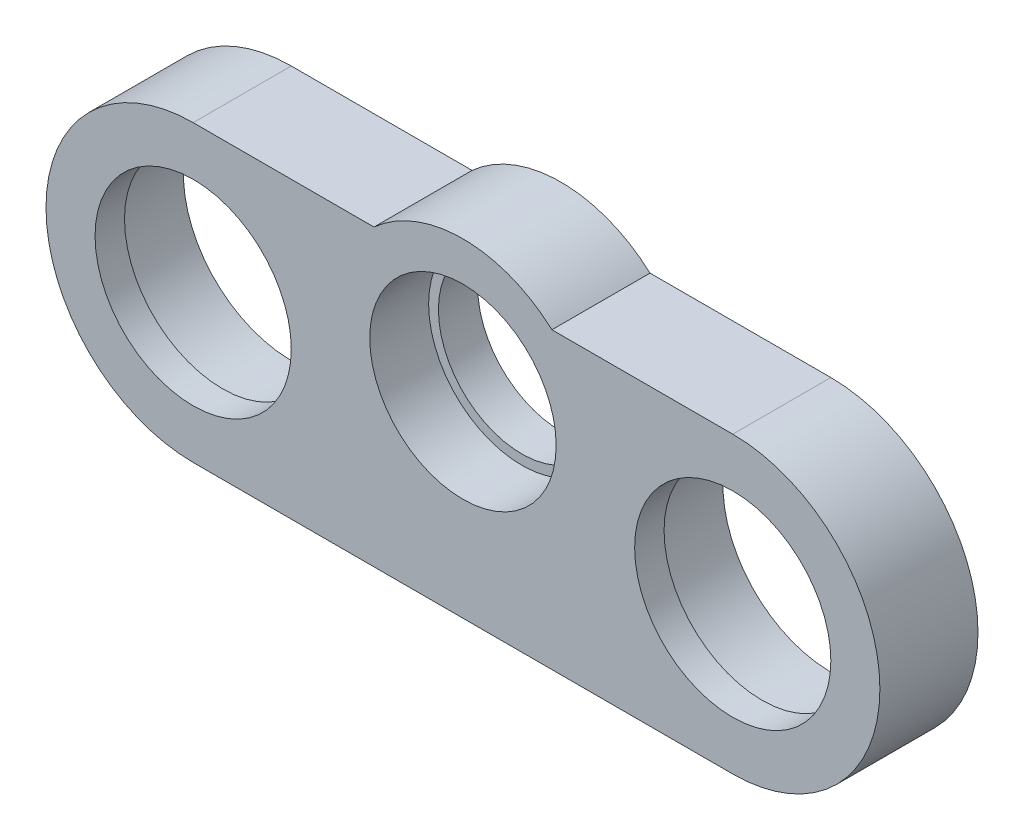
ISO-10303-21;
HEADER;
FILE_DESCRIPTION(('STEP AP214'),'2;1');
FILE_NAME('part.step','',(''),(''),'','','');
FILE_SCHEMA(('AUTOMOTIVE_DESIGN { 1 0 10303 214 1 1 1 1 }'));
ENDSEC;
DATA;
#1=APPLICATION_CONTEXT('core data for automotive mechanical design processes');
#2=APPLICATION_PROTOCOL_DEFINITION('international standard','automotive_design',2000,#1);
#3=PRODUCT_CONTEXT('',#1,'mechanical');
#4=PRODUCT('Part','Part','',(#3));
#5=PRODUCT_RELATED_PRODUCT_CATEGORY('part','',(#4));
#6=PRODUCT_DEFINITION_FORMATION('','',#4);
#7=PRODUCT_DEFINITION_CONTEXT('part definition',#1,'design');
#8=PRODUCT_DEFINITION('design','',#6,#7);
#9=PRODUCT_DEFINITION_SHAPE('','',#8);
#10=(LENGTH_UNIT() NAMED_UNIT(*) SI_UNIT(.MILLI.,.METRE.));
#11=(NAMED_UNIT(*) PLANE_ANGLE_UNIT() SI_UNIT($,.RADIAN.));
#12=(NAMED_UNIT(*) SI_UNIT($,.STERADIAN.) SOLID_ANGLE_UNIT());
#13=UNCERTAINTY_MEASURE_WITH_UNIT(LENGTH_MEASURE(1.E-05),#10,'distance_accuracy_value','');
#14=(GEOMETRIC_REPRESENTATION_CONTEXT(3) GLOBAL_UNCERTAINTY_ASSIGNED_CONTEXT((#13)) GLOBAL_UNIT_ASSIGNED_CONTEXT((#10,
#11,#12)) REPRESENTATION_CONTEXT('',''));
#15=CARTESIAN_POINT('',(0.,0.,0.));
#16=DIRECTION('',(0.,0.,1.));
#17=DIRECTION('',(1.,0.,0.));
#18=AXIS2_PLACEMENT_3D('',#15,#16,#17);
#19=CARTESIAN_POINT('',(0.,5.,10.));
#20=DIRECTION('',(0.,0.,-1.));
#21=DIRECTION('',(-1.,0.,0.));
#22=AXIS2_PLACEMENT_3D('',#19,#20,#21);
#23=CYLINDRICAL_SURFACE('',#22,9.5);
#24=CARTESIAN_POINT('',(0.,5.,10.));
#25=DIRECTION('',(0.,0.,1.));
#26=DIRECTION('',(1.,0.,0.));
#27=AXIS2_PLACEMENT_3D('',#24,#25,#26);
#28=CIRCLE('',#27,9.5);
#29=CARTESIAN_POINT('',(9.5,5.,10.));
#30=VERTEX_POINT('',#29);
#31=EDGE_CURVE('E140',#30,#30,#28,.T.);
#32=ORIENTED_EDGE('',*,*,#31,.T.);
#33=EDGE_LOOP('',(#32));
#34=FACE_BOUND('',#33,.T.);
#35=CARTESIAN_POINT('',(0.,5.,4.));
#36=DIRECTION('',(0.,0.,-1.));
#37=DIRECTION('',(-1.,0.,0.));
#38=AXIS2_PLACEMENT_3D('',#35,#36,#37);
#39=CIRCLE('',#38,9.5);
#40=CARTESIAN_POINT('',(-9.5,5.,4.));
#41=VERTEX_POINT('',#40);
#42=EDGE_CURVE('E180',#41,#41,#39,.T.);
#43=ORIENTED_EDGE('',*,*,#42,.T.);
#44=EDGE_LOOP('',(#43));
#45=FACE_BOUND('',#44,.T.);
#46=ADVANCED_FACE('F39',(#34,#45),#23,.F.);
#47=CARTESIAN_POINT('',(27.5,0.,10.));
#48=DIRECTION('',(0.,0.,-1.));
#49=DIRECTION('',(-1.,0.,0.));
#50=AXIS2_PLACEMENT_3D('',#47,#48,#49);
#51=CYLINDRICAL_SURFACE('',#50,11.);
#52=CARTESIAN_POINT('',(27.5,0.,0.));
#53=DIRECTION('',(0.,0.,1.));
#54=DIRECTION('',(1.,0.,0.));
#55=AXIS2_PLACEMENT_3D('',#52,#53,#54);
#56=CIRCLE('',#55,11.);
#57=CARTESIAN_POINT('',(38.5,0.,0.));
#58=VERTEX_POINT('',#57);
#59=EDGE_CURVE('E134',#58,#58,#56,.T.);
#60=ORIENTED_EDGE('',*,*,#59,.F.);
#61=EDGE_LOOP('',(#60));
#62=FACE_BOUND('',#61,.T.);
#63=CARTESIAN_POINT('',(27.5,0.,7.));
#64=DIRECTION('',(0.,0.,1.));
#65=DIRECTION('',(1.,0.,0.));
#66=AXIS2_PLACEMENT_3D('',#63,#64,#65);
#67=CIRCLE('',#66,11.);
#68=CARTESIAN_POINT('',(38.5,0.,7.));
#69=VERTEX_POINT('',#68);
#70=EDGE_CURVE('E194',#69,#69,#67,.T.);
#71=ORIENTED_EDGE('',*,*,#70,.T.);
#72=EDGE_LOOP('',(#71));
#73=FACE_BOUND('',#72,.T.);
#74=ADVANCED_FACE('F168',(#62,#73),#51,.F.);
#75=CARTESIAN_POINT('',(-27.5,0.,10.));
#76=DIRECTION('',(0.,0.,-1.));
#77=DIRECTION('',(-1.,0.,0.));
#78=AXIS2_PLACEMENT_3D('',#75,#76,#77);
#79=CYLINDRICAL_SURFACE('',#78,11.);
#80=CARTESIAN_POINT('',(-27.5,0.,0.));
#81=DIRECTION('',(0.,0.,1.));
#82=DIRECTION('',(1.,0.,0.));
#83=AXIS2_PLACEMENT_3D('',#80,#81,#82);
#84=CIRCLE('',#83,11.);
#85=CARTESIAN_POINT('',(-16.5,0.,0.));
#86=VERTEX_POINT('',#85);
#87=EDGE_CURVE('E137',#86,#86,#84,.T.);
#88=ORIENTED_EDGE('',*,*,#87,.F.);
#89=EDGE_LOOP('',(#88));
#90=FACE_BOUND('',#89,.T.);
#91=CARTESIAN_POINT('',(-27.5,0.,7.));
#92=DIRECTION('',(0.,0.,1.));
#93=DIRECTION('',(1.,0.,0.));
#94=AXIS2_PLACEMENT_3D('',#91,#92,#93);
#95=CIRCLE('',#94,11.);
#96=CARTESIAN_POINT('',(-16.5,0.,7.));
#97=VERTEX_POINT('',#96);
#98=EDGE_CURVE('E127',#97,#97,#95,.T.);
#99=ORIENTED_EDGE('',*,*,#98,.T.);
#100=EDGE_LOOP('',(#99));
#101=FACE_BOUND('',#100,.T.);
#102=ADVANCED_FACE('F173',(#90,#101),#79,.F.);
#103=CARTESIAN_POINT('',(0.,15.,10.));
#104=DIRECTION('',(0.,-1.,0.));
#105=DIRECTION('',(1.,0.,0.));
#106=AXIS2_PLACEMENT_3D('',#103,#104,#105);
#107=PLANE('',#106);
#108=DIRECTION('',(-1.,0.,0.));
#109=VECTOR('',#108,1.);
#110=CARTESIAN_POINT('',(0.,15.,0.));
#111=LINE('',#110,#109);
#112=CARTESIAN_POINT('',(27.5,15.,0.));
#113=VERTEX_POINT('',#112);
#114=CARTESIAN_POINT('',(9.06917857360852,15.,0.));
#115=VERTEX_POINT('',#114);
#116=EDGE_CURVE('E123',#113,#115,#111,.T.);
#117=ORIENTED_EDGE('',*,*,#116,.T.);
#118=DIRECTION('',(0.,0.,-1.));
#119=VECTOR('',#118,1.);
#120=CARTESIAN_POINT('',(9.06917857360852,15.,10.));
#121=LINE('',#120,#119);
#122=CARTESIAN_POINT('',(9.06917857360852,15.,10.));
#123=VERTEX_POINT('',#122);
#124=EDGE_CURVE('E11',#123,#115,#121,.T.);
#125=ORIENTED_EDGE('',*,*,#124,.F.);
#126=DIRECTION('',(-1.,0.,0.));
#127=VECTOR('',#126,1.);
#128=CARTESIAN_POINT('',(0.,15.,10.));
#129=LINE('',#128,#127);
#130=CARTESIAN_POINT('',(27.5,15.,10.));
#131=VERTEX_POINT('',#130);
#132=EDGE_CURVE('E155',#131,#123,#129,.T.);
#133=ORIENTED_EDGE('',*,*,#132,.F.);
#134=DIRECTION('',(0.,0.,-1.));
#135=VECTOR('',#134,1.);
#136=CARTESIAN_POINT('',(27.5,15.,10.));
#137=LINE('',#136,#135);
#138=EDGE_CURVE('E119',#131,#113,#137,.T.);
#139=ORIENTED_EDGE('',*,*,#138,.T.);
#140=EDGE_LOOP('',(#117,#125,#133,#139));
#141=FACE_BOUND('',#140,.T.);
#142=ADVANCED_FACE('F153',(#141),#107,.F.);
#143=CARTESIAN_POINT('',(0.,5.,10.));
#144=DIRECTION('',(0.,0.,-1.));
#145=DIRECTION('',(-1.,0.,0.));
#146=AXIS2_PLACEMENT_3D('',#143,#144,#145);
#147=CYLINDRICAL_SURFACE('',#146,13.5);
#148=CARTESIAN_POINT('',(0.,5.,0.));
#149=DIRECTION('',(0.,0.,1.));
#150=DIRECTION('',(1.,0.,0.));
#151=AXIS2_PLACEMENT_3D('',#148,#149,#150);
#152=CIRCLE('',#151,13.5);
#153=CARTESIAN_POINT('',(-9.06917857360852,15.,0.));
#154=VERTEX_POINT('',#153);
#155=EDGE_CURVE('E126',#115,#154,#152,.T.);
#156=ORIENTED_EDGE('',*,*,#155,.T.);
#157=DIRECTION('',(0.,0.,-1.));
#158=VECTOR('',#157,1.);
#159=CARTESIAN_POINT('',(-9.06917857360852,15.,10.));
#160=LINE('',#159,#158);
#161=CARTESIAN_POINT('',(-9.06917857360852,15.,10.));
#162=VERTEX_POINT('',#161);
#163=EDGE_CURVE('E47',#162,#154,#160,.T.);
#164=ORIENTED_EDGE('',*,*,#163,.F.);
#165=CARTESIAN_POINT('',(0.,5.,10.));
#166=DIRECTION('',(0.,0.,1.));
#167=DIRECTION('',(1.,0.,0.));
#168=AXIS2_PLACEMENT_3D('',#165,#166,#167);
#169=CIRCLE('',#168,13.5);
#170=EDGE_CURVE('E88',#123,#162,#169,.T.);
#171=ORIENTED_EDGE('',*,*,#170,.F.);
#172=ORIENTED_EDGE('',*,*,#124,.T.);
#173=EDGE_LOOP('',(#156,#164,#171,#172));
#174=FACE_BOUND('',#173,.T.);
#175=ADVANCED_FACE('F230',(#174),#147,.T.);
#176=CARTESIAN_POINT('',(-27.5,15.,0.));
#177=VERTEX_POINT('',#176);
#178=EDGE_CURVE('E128',#154,#177,#111,.T.);
#179=ORIENTED_EDGE('',*,*,#178,.T.);
#180=DIRECTION('',(0.,0.,-1.));
#181=VECTOR('',#180,1.);
#182=CARTESIAN_POINT('',(-27.5,15.,10.));
#183=LINE('',#182,#181);
#184=CARTESIAN_POINT('',(-27.5,15.,10.));
#185=VERTEX_POINT('',#184);
#186=EDGE_CURVE('E115',#185,#177,#183,.T.);
#187=ORIENTED_EDGE('',*,*,#186,.F.);
#188=EDGE_CURVE('E102',#162,#185,#129,.T.);
#189=ORIENTED_EDGE('',*,*,#188,.F.);
#190=ORIENTED_EDGE('',*,*,#163,.T.);
#191=EDGE_LOOP('',(#179,#187,#189,#190));
#192=FACE_BOUND('',#191,.T.);
#193=ADVANCED_FACE('F146',(#192),#107,.F.);
#194=CARTESIAN_POINT('',(-27.5,0.,10.));
#195=DIRECTION('',(0.,0.,-1.));
#196=DIRECTION('',(-1.,0.,0.));
#197=AXIS2_PLACEMENT_3D('',#194,#195,#196);
#198=CYLINDRICAL_SURFACE('',#197,15.);
#199=CARTESIAN_POINT('',(-27.5,0.,0.));
#200=DIRECTION('',(0.,0.,1.));
#201=DIRECTION('',(1.,0.,0.));
#202=AXIS2_PLACEMENT_3D('',#199,#200,#201);
#203=CIRCLE('',#202,15.);
#204=CARTESIAN_POINT('',(-27.5,-15.,0.));
#205=VERTEX_POINT('',#204);
#206=EDGE_CURVE('E111',#177,#205,#203,.T.);
#207=ORIENTED_EDGE('',*,*,#206,.T.);
#208=DIRECTION('',(0.,0.,-1.));
#209=VECTOR('',#208,1.);
#210=CARTESIAN_POINT('',(-27.5,-15.,10.));
#211=LINE('',#210,#209);
#212=CARTESIAN_POINT('',(-27.5,-15.,10.));
#213=VERTEX_POINT('',#212);
#214=EDGE_CURVE('E108',#213,#205,#211,.T.);
#215=ORIENTED_EDGE('',*,*,#214,.F.);
#216=CARTESIAN_POINT('',(-27.5,0.,10.));
#217=DIRECTION('',(0.,0.,1.));
#218=DIRECTION('',(1.,0.,0.));
#219=AXIS2_PLACEMENT_3D('',#216,#217,#218);
#220=CIRCLE('',#219,15.);
#221=EDGE_CURVE('E95',#185,#213,#220,.T.);
#222=ORIENTED_EDGE('',*,*,#221,.F.);
#223=ORIENTED_EDGE('',*,*,#186,.T.);
#224=EDGE_LOOP('',(#207,#215,#222,#223));
#225=FACE_BOUND('',#224,.T.);
#226=ADVANCED_FACE('F109',(#225),#198,.T.);
#227=CARTESIAN_POINT('',(0.,-15.,10.));
#228=DIRECTION('',(0.,-1.,0.));
#229=DIRECTION('',(1.,0.,0.));
#230=AXIS2_PLACEMENT_3D('',#227,#228,#229);
#231=PLANE('',#230);
#232=DIRECTION('',(-1.,0.,0.));
#233=VECTOR('',#232,1.);
#234=CARTESIAN_POINT('',(0.,-15.,0.));
#235=LINE('',#234,#233);
#236=CARTESIAN_POINT('',(27.5,-15.,0.));
#237=VERTEX_POINT('',#236);
#238=EDGE_CURVE('E131',#237,#205,#235,.T.);
#239=ORIENTED_EDGE('',*,*,#238,.F.);
#240=DIRECTION('',(0.,0.,-1.));
#241=VECTOR('',#240,1.);
#242=CARTESIAN_POINT('',(27.5,-15.,10.));
#243=LINE('',#242,#241);
#244=CARTESIAN_POINT('',(27.5,-15.,10.));
#245=VERTEX_POINT('',#244);
#246=EDGE_CURVE('E77',#245,#237,#243,.T.);
#247=ORIENTED_EDGE('',*,*,#246,.F.);
#248=DIRECTION('',(-1.,0.,0.));
#249=VECTOR('',#248,1.);
#250=CARTESIAN_POINT('',(0.,-15.,10.));
#251=LINE('',#250,#249);
#252=EDGE_CURVE('E100',#245,#213,#251,.T.);
#253=ORIENTED_EDGE('',*,*,#252,.T.);
#254=ORIENTED_EDGE('',*,*,#214,.T.);
#255=EDGE_LOOP('',(#239,#247,#253,#254));
#256=FACE_BOUND('',#255,.T.);
#257=ADVANCED_FACE('F117',(#256),#231,.T.);
#258=CARTESIAN_POINT('',(27.5,0.,10.));
#259=DIRECTION('',(0.,0.,-1.));
#260=DIRECTION('',(-1.,0.,0.));
#261=AXIS2_PLACEMENT_3D('',#258,#259,#260);
#262=CYLINDRICAL_SURFACE('',#261,15.);
#263=CARTESIAN_POINT('',(27.5,0.,0.));
#264=DIRECTION('',(0.,0.,1.));
#265=DIRECTION('',(1.,0.,0.));
#266=AXIS2_PLACEMENT_3D('',#263,#264,#265);
#267=CIRCLE('',#266,15.);
#268=EDGE_CURVE('E80',#237,#113,#267,.T.);
#269=ORIENTED_EDGE('',*,*,#268,.T.);
#270=ORIENTED_EDGE('',*,*,#138,.F.);
#271=CARTESIAN_POINT('',(27.5,0.,10.));
#272=DIRECTION('',(0.,0.,1.));
#273=DIRECTION('',(1.,0.,0.));
#274=AXIS2_PLACEMENT_3D('',#271,#272,#273);
#275=CIRCLE('',#274,15.);
#276=EDGE_CURVE('E55',#245,#131,#275,.T.);
#277=ORIENTED_EDGE('',*,*,#276,.F.);
#278=ORIENTED_EDGE('',*,*,#246,.T.);
#279=EDGE_LOOP('',(#269,#270,#277,#278));
#280=FACE_BOUND('',#279,.T.);
#281=ADVANCED_FACE('F156',(#280),#262,.T.);
#282=CARTESIAN_POINT('',(0.,0.,10.));
#283=DIRECTION('',(0.,0.,1.));
#284=DIRECTION('',(1.,0.,0.));
#285=AXIS2_PLACEMENT_3D('',#282,#283,#284);
#286=PLANE('',#285);
#287=ORIENTED_EDGE('',*,*,#31,.F.);
#288=EDGE_LOOP('',(#287));
#289=FACE_BOUND('',#288,.T.);
#290=ORIENTED_EDGE('',*,*,#132,.T.);
#291=ORIENTED_EDGE('',*,*,#170,.T.);
#292=ORIENTED_EDGE('',*,*,#188,.T.);
#293=ORIENTED_EDGE('',*,*,#221,.T.);
#294=ORIENTED_EDGE('',*,*,#252,.F.);
#295=ORIENTED_EDGE('',*,*,#276,.T.);
#296=EDGE_LOOP('',(#290,#291,#292,#293,#294,#295));
#297=FACE_BOUND('',#296,.T.);
#298=CARTESIAN_POINT('',(-27.5,0.,10.));
#299=DIRECTION('',(0.,0.,1.));
#300=DIRECTION('',(1.,0.,0.));
#301=AXIS2_PLACEMENT_3D('',#298,#299,#300);
#302=CIRCLE('',#301,10.);
#303=CARTESIAN_POINT('',(-17.5,0.,10.));
#304=VERTEX_POINT('',#303);
#305=EDGE_CURVE('E198',#304,#304,#302,.T.);
#306=ORIENTED_EDGE('',*,*,#305,.F.);
#307=EDGE_LOOP('',(#306));
#308=FACE_BOUND('',#307,.T.);
#309=CARTESIAN_POINT('',(27.5,0.,10.));
#310=DIRECTION('',(0.,0.,1.));
#311=DIRECTION('',(1.,0.,0.));
#312=AXIS2_PLACEMENT_3D('',#309,#310,#311);
#313=CIRCLE('',#312,9.99999999999999);
#314=CARTESIAN_POINT('',(37.5,0.,10.));
#315=VERTEX_POINT('',#314);
#316=EDGE_CURVE('E182',#315,#315,#313,.T.);
#317=ORIENTED_EDGE('',*,*,#316,.F.);
#318=EDGE_LOOP('',(#317));
#319=FACE_BOUND('',#318,.T.);
#320=ADVANCED_FACE('F97',(#289,#297,#308,#319),#286,.T.);
#321=CARTESIAN_POINT('',(0.,0.,0.));
#322=DIRECTION('',(0.,0.,1.));
#323=DIRECTION('',(1.,0.,0.));
#324=AXIS2_PLACEMENT_3D('',#321,#322,#323);
#325=PLANE('',#324);
#326=ORIENTED_EDGE('',*,*,#116,.F.);
#327=ORIENTED_EDGE('',*,*,#268,.F.);
#328=ORIENTED_EDGE('',*,*,#238,.T.);
#329=ORIENTED_EDGE('',*,*,#206,.F.);
#330=ORIENTED_EDGE('',*,*,#178,.F.);
#331=ORIENTED_EDGE('',*,*,#155,.F.);
#332=EDGE_LOOP('',(#326,#327,#328,#329,#330,#331));
#333=FACE_BOUND('',#332,.T.);
#334=ORIENTED_EDGE('',*,*,#59,.T.);
#335=EDGE_LOOP('',(#334));
#336=FACE_BOUND('',#335,.T.);
#337=ORIENTED_EDGE('',*,*,#87,.T.);
#338=EDGE_LOOP('',(#337));
#339=FACE_BOUND('',#338,.T.);
#340=CARTESIAN_POINT('',(0.,5.,0.));
#341=DIRECTION('',(0.,0.,-1.));
#342=DIRECTION('',(-1.,0.,0.));
#343=AXIS2_PLACEMENT_3D('',#340,#341,#342);
#344=CIRCLE('',#343,8.5);
#345=CARTESIAN_POINT('',(-8.5,5.,0.));
#346=VERTEX_POINT('',#345);
#347=EDGE_CURVE('E189',#346,#346,#344,.T.);
#348=ORIENTED_EDGE('',*,*,#347,.F.);
#349=EDGE_LOOP('',(#348));
#350=FACE_BOUND('',#349,.T.);
#351=ADVANCED_FACE('F149',(#333,#336,#339,#350),#325,.F.);
#352=CARTESIAN_POINT('',(-27.5,0.,7.));
#353=DIRECTION('',(0.,0.,1.));
#354=DIRECTION('',(1.,0.,0.));
#355=AXIS2_PLACEMENT_3D('',#352,#353,#354);
#356=PLANE('',#355);
#357=CARTESIAN_POINT('',(-27.5,0.,7.));
#358=DIRECTION('',(0.,0.,1.));
#359=DIRECTION('',(1.,0.,0.));
#360=AXIS2_PLACEMENT_3D('',#357,#358,#359);
#361=CIRCLE('',#360,10.);
#362=CARTESIAN_POINT('',(-17.5,0.,7.));
#363=VERTEX_POINT('',#362);
#364=EDGE_CURVE('E199',#363,#363,#361,.T.);
#365=ORIENTED_EDGE('',*,*,#364,.T.);
#366=EDGE_LOOP('',(#365));
#367=FACE_BOUND('',#366,.T.);
#368=ORIENTED_EDGE('',*,*,#98,.F.);
#369=EDGE_LOOP('',(#368));
#370=FACE_BOUND('',#369,.T.);
#371=ADVANCED_FACE('F210',(#367,#370),#356,.F.);
#372=CARTESIAN_POINT('',(-27.5,0.,7.));
#373=DIRECTION('',(0.,0.,1.));
#374=DIRECTION('',(1.,0.,0.));
#375=AXIS2_PLACEMENT_3D('',#372,#373,#374);
#376=CYLINDRICAL_SURFACE('',#375,10.);
#377=ORIENTED_EDGE('',*,*,#364,.F.);
#378=EDGE_LOOP('',(#377));
#379=FACE_BOUND('',#378,.T.);
#380=ORIENTED_EDGE('',*,*,#305,.T.);
#381=EDGE_LOOP('',(#380));
#382=FACE_BOUND('',#381,.T.);
#383=ADVANCED_FACE('F212',(#379,#382),#376,.F.);
#384=CARTESIAN_POINT('',(27.5,0.,7.));
#385=DIRECTION('',(0.,0.,1.));
#386=DIRECTION('',(1.,0.,0.));
#387=AXIS2_PLACEMENT_3D('',#384,#385,#386);
#388=PLANE('',#387);
#389=CARTESIAN_POINT('',(27.5,0.,7.));
#390=DIRECTION('',(0.,0.,1.));
#391=DIRECTION('',(1.,0.,0.));
#392=AXIS2_PLACEMENT_3D('',#389,#390,#391);
#393=CIRCLE('',#392,9.99999999999999);
#394=CARTESIAN_POINT('',(37.5,0.,7.));
#395=VERTEX_POINT('',#394);
#396=EDGE_CURVE('E186',#395,#395,#393,.T.);
#397=ORIENTED_EDGE('',*,*,#396,.T.);
#398=EDGE_LOOP('',(#397));
#399=FACE_BOUND('',#398,.T.);
#400=ORIENTED_EDGE('',*,*,#70,.F.);
#401=EDGE_LOOP('',(#400));
#402=FACE_BOUND('',#401,.T.);
#403=ADVANCED_FACE('F219',(#399,#402),#388,.F.);
#404=CARTESIAN_POINT('',(27.5,0.,7.));
#405=DIRECTION('',(0.,0.,1.));
#406=DIRECTION('',(1.,0.,0.));
#407=AXIS2_PLACEMENT_3D('',#404,#405,#406);
#408=CYLINDRICAL_SURFACE('',#407,9.99999999999999);
#409=ORIENTED_EDGE('',*,*,#396,.F.);
#410=EDGE_LOOP('',(#409));
#411=FACE_BOUND('',#410,.T.);
#412=ORIENTED_EDGE('',*,*,#316,.T.);
#413=EDGE_LOOP('',(#412));
#414=FACE_BOUND('',#413,.T.);
#415=ADVANCED_FACE('F246',(#411,#414),#408,.F.);
#416=CARTESIAN_POINT('',(0.,5.,4.));
#417=DIRECTION('',(0.,0.,-1.));
#418=DIRECTION('',(-1.,0.,0.));
#419=AXIS2_PLACEMENT_3D('',#416,#417,#418);
#420=PLANE('',#419);
#421=CARTESIAN_POINT('',(0.,5.,4.));
#422=DIRECTION('',(0.,0.,-1.));
#423=DIRECTION('',(-1.,0.,0.));
#424=AXIS2_PLACEMENT_3D('',#421,#422,#423);
#425=CIRCLE('',#424,8.5);
#426=CARTESIAN_POINT('',(-8.5,5.,4.));
#427=VERTEX_POINT('',#426);
#428=EDGE_CURVE('E183',#427,#427,#425,.T.);
#429=ORIENTED_EDGE('',*,*,#428,.T.);
#430=EDGE_LOOP('',(#429));
#431=FACE_BOUND('',#430,.T.);
#432=ORIENTED_EDGE('',*,*,#42,.F.);
#433=EDGE_LOOP('',(#432));
#434=FACE_BOUND('',#433,.T.);
#435=ADVANCED_FACE('F240',(#431,#434),#420,.F.);
#436=CARTESIAN_POINT('',(0.,5.,4.));
#437=DIRECTION('',(0.,0.,-1.));
#438=DIRECTION('',(-1.,0.,0.));
#439=AXIS2_PLACEMENT_3D('',#436,#437,#438);
#440=CYLINDRICAL_SURFACE('',#439,8.5);
#441=ORIENTED_EDGE('',*,*,#428,.F.);
#442=EDGE_LOOP('',(#441));
#443=FACE_BOUND('',#442,.T.);
#444=ORIENTED_EDGE('',*,*,#347,.T.);
#445=EDGE_LOOP('',(#444));
#446=FACE_BOUND('',#445,.T.);
#447=ADVANCED_FACE('F238',(#443,#446),#440,.F.);
#448=CLOSED_SHELL('',(#46,#74,#102,#142,#175,#193,#226,#257,#281,#320,#351,#371,#383,#403,#415,
#435,#447));
#449=MANIFOLD_SOLID_BREP('B2',#448);
#450=ADVANCED_BREP_SHAPE_REPRESENTATION('',(#18,#449),#14);
#451=SHAPE_DEFINITION_REPRESENTATION(#9,#450);
ENDSEC;
END-ISO-10303-21;
